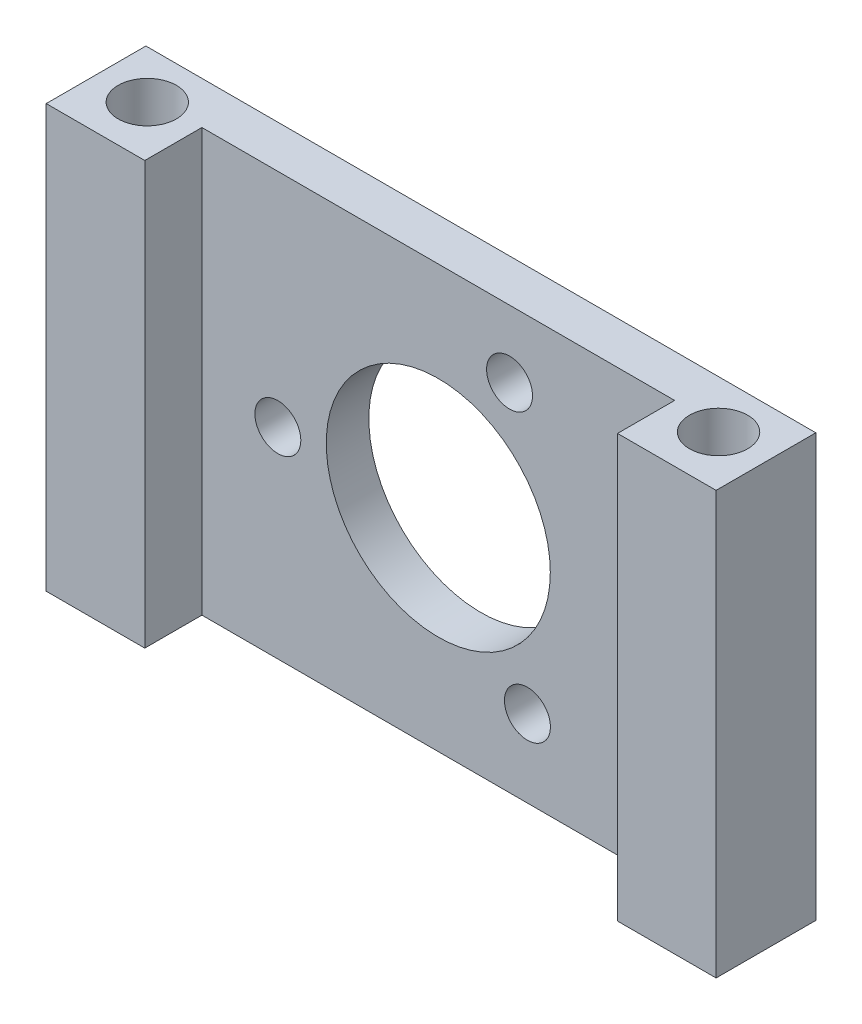
ISO-10303-21;
HEADER;
FILE_DESCRIPTION(('STEP AP214'),'2;1');
FILE_NAME('part.step','',(''),(''),'','','');
FILE_SCHEMA(('AUTOMOTIVE_DESIGN { 1 0 10303 214 1 1 1 1 }'));
ENDSEC;
DATA;
#1=APPLICATION_CONTEXT('core data for automotive mechanical design processes');
#2=APPLICATION_PROTOCOL_DEFINITION('international standard','automotive_design',2000,#1);
#3=PRODUCT_CONTEXT('',#1,'mechanical');
#4=PRODUCT('Part','Part','',(#3));
#5=PRODUCT_RELATED_PRODUCT_CATEGORY('part','',(#4));
#6=PRODUCT_DEFINITION_FORMATION('','',#4);
#7=PRODUCT_DEFINITION_CONTEXT('part definition',#1,'design');
#8=PRODUCT_DEFINITION('design','',#6,#7);
#9=PRODUCT_DEFINITION_SHAPE('','',#8);
#10=(LENGTH_UNIT() NAMED_UNIT(*) SI_UNIT(.MILLI.,.METRE.));
#11=(NAMED_UNIT(*) PLANE_ANGLE_UNIT() SI_UNIT($,.RADIAN.));
#12=(NAMED_UNIT(*) SI_UNIT($,.STERADIAN.) SOLID_ANGLE_UNIT());
#13=UNCERTAINTY_MEASURE_WITH_UNIT(LENGTH_MEASURE(1.E-05),#10,'distance_accuracy_value','');
#14=(GEOMETRIC_REPRESENTATION_CONTEXT(3) GLOBAL_UNCERTAINTY_ASSIGNED_CONTEXT((#13)) GLOBAL_UNIT_ASSIGNED_CONTEXT((#10,
#11,#12)) REPRESENTATION_CONTEXT('',''));
#15=CARTESIAN_POINT('',(0.,0.,0.));
#16=DIRECTION('',(0.,0.,1.));
#17=DIRECTION('',(1.,0.,0.));
#18=AXIS2_PLACEMENT_3D('',#15,#16,#17);
#19=CARTESIAN_POINT('',(0.,0.,8.9));
#20=DIRECTION('',(0.,0.,1.));
#21=DIRECTION('',(1.,0.,0.));
#22=AXIS2_PLACEMENT_3D('',#19,#20,#21);
#23=PLANE('',#22);
#24=DIRECTION('',(0.,-1.,0.));
#25=VECTOR('',#24,1.);
#26=CARTESIAN_POINT('',(-21.1000000000002,18.85,8.9));
#27=LINE('',#26,#25);
#28=CARTESIAN_POINT('',(-21.1000000000002,18.85,8.9));
#29=VERTEX_POINT('',#28);
#30=CARTESIAN_POINT('',(-21.1000000000002,-18.85,8.9));
#31=VERTEX_POINT('',#30);
#32=EDGE_CURVE('E117',#29,#31,#27,.T.);
#33=ORIENTED_EDGE('',*,*,#32,.F.);
#34=DIRECTION('',(-1.,0.,0.));
#35=VECTOR('',#34,1.);
#36=CARTESIAN_POINT('',(-29.9000000000002,18.85,8.9));
#37=LINE('',#36,#35);
#38=CARTESIAN_POINT('',(-29.9000000000002,18.85,8.9));
#39=VERTEX_POINT('',#38);
#40=EDGE_CURVE('E150',#29,#39,#37,.T.);
#41=ORIENTED_EDGE('',*,*,#40,.T.);
#42=DIRECTION('',(0.,-1.,0.));
#43=VECTOR('',#42,1.);
#44=CARTESIAN_POINT('',(-29.9000000000002,18.85,8.9));
#45=LINE('',#44,#43);
#46=CARTESIAN_POINT('',(-29.9000000000002,-18.85,8.9));
#47=VERTEX_POINT('',#46);
#48=EDGE_CURVE('E152',#39,#47,#45,.T.);
#49=ORIENTED_EDGE('',*,*,#48,.T.);
#50=DIRECTION('',(1.,0.,0.));
#51=VECTOR('',#50,1.);
#52=CARTESIAN_POINT('',(-29.9000000000002,-18.85,8.9));
#53=LINE('',#52,#51);
#54=EDGE_CURVE('E154',#47,#31,#53,.T.);
#55=ORIENTED_EDGE('',*,*,#54,.T.);
#56=EDGE_LOOP('',(#33,#41,#49,#55));
#57=FACE_BOUND('',#56,.T.);
#58=ADVANCED_FACE('F37',(#57),#23,.T.);
#59=CARTESIAN_POINT('',(29.8999999999998,18.85,8.9));
#60=DIRECTION('',(-1.,0.,0.));
#61=DIRECTION('',(0.,-1.,0.));
#62=AXIS2_PLACEMENT_3D('',#59,#60,#61);
#63=PLANE('',#62);
#64=DIRECTION('',(0.,1.,0.));
#65=VECTOR('',#64,1.);
#66=CARTESIAN_POINT('',(29.8999999999998,18.85,0.));
#67=LINE('',#66,#65);
#68=CARTESIAN_POINT('',(29.8999999999998,-18.85,0.));
#69=VERTEX_POINT('',#68);
#70=CARTESIAN_POINT('',(29.8999999999998,18.85,0.));
#71=VERTEX_POINT('',#70);
#72=EDGE_CURVE('E144',#69,#71,#67,.T.);
#73=ORIENTED_EDGE('',*,*,#72,.T.);
#74=DIRECTION('',(0.,0.,-1.));
#75=VECTOR('',#74,1.);
#76=CARTESIAN_POINT('',(29.8999999999998,18.85,8.9));
#77=LINE('',#76,#75);
#78=CARTESIAN_POINT('',(29.8999999999998,18.85,8.9));
#79=VERTEX_POINT('',#78);
#80=EDGE_CURVE('E11',#79,#71,#77,.T.);
#81=ORIENTED_EDGE('',*,*,#80,.F.);
#82=DIRECTION('',(0.,1.,0.));
#83=VECTOR('',#82,1.);
#84=CARTESIAN_POINT('',(29.8999999999998,18.85,8.9));
#85=LINE('',#84,#83);
#86=CARTESIAN_POINT('',(29.8999999999998,-18.85,8.9));
#87=VERTEX_POINT('',#86);
#88=EDGE_CURVE('E148',#87,#79,#85,.T.);
#89=ORIENTED_EDGE('',*,*,#88,.F.);
#90=DIRECTION('',(0.,0.,-1.));
#91=VECTOR('',#90,1.);
#92=CARTESIAN_POINT('',(29.8999999999998,-18.85,8.9));
#93=LINE('',#92,#91);
#94=EDGE_CURVE('E156',#87,#69,#93,.T.);
#95=ORIENTED_EDGE('',*,*,#94,.T.);
#96=EDGE_LOOP('',(#73,#81,#89,#95));
#97=FACE_BOUND('',#96,.T.);
#98=ADVANCED_FACE('F39',(#97),#63,.F.);
#99=CARTESIAN_POINT('',(-29.9000000000002,18.85,8.9));
#100=DIRECTION('',(0.,-1.,0.));
#101=DIRECTION('',(0.,0.,-1.));
#102=AXIS2_PLACEMENT_3D('',#99,#100,#101);
#103=PLANE('',#102);
#104=CARTESIAN_POINT('',(25.4999999999998,18.85,4.27874065550468));
#105=DIRECTION('',(0.,1.,0.));
#106=DIRECTION('',(0.,0.,1.));
#107=AXIS2_PLACEMENT_3D('',#104,#105,#106);
#108=CIRCLE('',#107,2.6);
#109=CARTESIAN_POINT('',(25.4999999999998,18.85,6.87874065550468));
#110=VERTEX_POINT('',#109);
#111=EDGE_CURVE('E212',#110,#110,#108,.T.);
#112=ORIENTED_EDGE('',*,*,#111,.F.);
#113=EDGE_LOOP('',(#112));
#114=FACE_BOUND('',#113,.T.);
#115=CARTESIAN_POINT('',(-25.4999999999998,18.85,4.27874065550468));
#116=DIRECTION('',(0.,1.,0.));
#117=DIRECTION('',(0.,0.,-1.));
#118=AXIS2_PLACEMENT_3D('',#115,#116,#117);
#119=CIRCLE('',#118,2.6);
#120=CARTESIAN_POINT('',(-25.4999999999998,18.85,1.67874065550468));
#121=VERTEX_POINT('',#120);
#122=EDGE_CURVE('E215',#121,#121,#119,.T.);
#123=ORIENTED_EDGE('',*,*,#122,.F.);
#124=EDGE_LOOP('',(#123));
#125=FACE_BOUND('',#124,.T.);
#126=ORIENTED_EDGE('',*,*,#40,.F.);
#127=DIRECTION('',(0.,0.,1.));
#128=VECTOR('',#127,1.);
#129=CARTESIAN_POINT('',(-21.1000000000002,18.85,3.8));
#130=LINE('',#129,#128);
#131=CARTESIAN_POINT('',(-21.1000000000002,18.85,3.8));
#132=VERTEX_POINT('',#131);
#133=EDGE_CURVE('E142',#132,#29,#130,.T.);
#134=ORIENTED_EDGE('',*,*,#133,.F.);
#135=DIRECTION('',(-1.,0.,0.));
#136=VECTOR('',#135,1.);
#137=CARTESIAN_POINT('',(-21.1000000000002,18.85,3.8));
#138=LINE('',#137,#136);
#139=CARTESIAN_POINT('',(21.0999999999998,18.85,3.8));
#140=VERTEX_POINT('',#139);
#141=EDGE_CURVE('E121',#140,#132,#138,.T.);
#142=ORIENTED_EDGE('',*,*,#141,.F.);
#143=DIRECTION('',(0.,0.,1.));
#144=VECTOR('',#143,1.);
#145=CARTESIAN_POINT('',(21.0999999999998,18.85,3.8));
#146=LINE('',#145,#144);
#147=CARTESIAN_POINT('',(21.0999999999998,18.85,8.9));
#148=VERTEX_POINT('',#147);
#149=EDGE_CURVE('E145',#140,#148,#146,.T.);
#150=ORIENTED_EDGE('',*,*,#149,.T.);
#151=EDGE_CURVE('E89',#79,#148,#37,.T.);
#152=ORIENTED_EDGE('',*,*,#151,.F.);
#153=ORIENTED_EDGE('',*,*,#80,.T.);
#154=DIRECTION('',(-1.,0.,0.));
#155=VECTOR('',#154,1.);
#156=CARTESIAN_POINT('',(-29.9000000000002,18.85,0.));
#157=LINE('',#156,#155);
#158=CARTESIAN_POINT('',(-29.9000000000002,18.85,0.));
#159=VERTEX_POINT('',#158);
#160=EDGE_CURVE('E159',#71,#159,#157,.T.);
#161=ORIENTED_EDGE('',*,*,#160,.T.);
#162=DIRECTION('',(0.,0.,-1.));
#163=VECTOR('',#162,1.);
#164=CARTESIAN_POINT('',(-29.9000000000002,18.85,8.9));
#165=LINE('',#164,#163);
#166=EDGE_CURVE('E45',#39,#159,#165,.T.);
#167=ORIENTED_EDGE('',*,*,#166,.F.);
#168=EDGE_LOOP('',(#126,#134,#142,#150,#152,#153,#161,#167));
#169=FACE_BOUND('',#168,.T.);
#170=ADVANCED_FACE('F182',(#114,#125,#169),#103,.F.);
#171=CARTESIAN_POINT('',(-29.9000000000002,18.85,8.9));
#172=DIRECTION('',(1.,0.,0.));
#173=DIRECTION('',(0.,1.,0.));
#174=AXIS2_PLACEMENT_3D('',#171,#172,#173);
#175=PLANE('',#174);
#176=DIRECTION('',(0.,-1.,0.));
#177=VECTOR('',#176,1.);
#178=CARTESIAN_POINT('',(-29.9000000000002,18.85,0.));
#179=LINE('',#178,#177);
#180=CARTESIAN_POINT('',(-29.9000000000002,-18.85,0.));
#181=VERTEX_POINT('',#180);
#182=EDGE_CURVE('E161',#159,#181,#179,.T.);
#183=ORIENTED_EDGE('',*,*,#182,.T.);
#184=DIRECTION('',(0.,0.,-1.));
#185=VECTOR('',#184,1.);
#186=CARTESIAN_POINT('',(-29.9000000000002,-18.85,8.9));
#187=LINE('',#186,#185);
#188=EDGE_CURVE('E165',#47,#181,#187,.T.);
#189=ORIENTED_EDGE('',*,*,#188,.F.);
#190=ORIENTED_EDGE('',*,*,#48,.F.);
#191=ORIENTED_EDGE('',*,*,#166,.T.);
#192=EDGE_LOOP('',(#183,#189,#190,#191));
#193=FACE_BOUND('',#192,.T.);
#194=ADVANCED_FACE('F171',(#193),#175,.F.);
#195=CARTESIAN_POINT('',(-29.9000000000002,-18.85,8.9));
#196=DIRECTION('',(0.,1.,0.));
#197=DIRECTION('',(0.,0.,1.));
#198=AXIS2_PLACEMENT_3D('',#195,#196,#197);
#199=PLANE('',#198);
#200=CARTESIAN_POINT('',(25.4999999999998,-18.85,4.27874065550468));
#201=DIRECTION('',(0.,1.,0.));
#202=DIRECTION('',(0.,0.,1.));
#203=AXIS2_PLACEMENT_3D('',#200,#201,#202);
#204=CIRCLE('',#203,2.6);
#205=CARTESIAN_POINT('',(25.4999999999998,-18.85,6.87874065550468));
#206=VERTEX_POINT('',#205);
#207=EDGE_CURVE('E140',#206,#206,#204,.T.);
#208=ORIENTED_EDGE('',*,*,#207,.T.);
#209=EDGE_LOOP('',(#208));
#210=FACE_BOUND('',#209,.T.);
#211=CARTESIAN_POINT('',(-25.4999999999998,-18.85,4.27874065550468));
#212=DIRECTION('',(0.,1.,0.));
#213=DIRECTION('',(0.,0.,-1.));
#214=AXIS2_PLACEMENT_3D('',#211,#212,#213);
#215=CIRCLE('',#214,2.6);
#216=CARTESIAN_POINT('',(-25.4999999999998,-18.85,1.67874065550468));
#217=VERTEX_POINT('',#216);
#218=EDGE_CURVE('E217',#217,#217,#215,.T.);
#219=ORIENTED_EDGE('',*,*,#218,.T.);
#220=EDGE_LOOP('',(#219));
#221=FACE_BOUND('',#220,.T.);
#222=DIRECTION('',(1.,0.,0.));
#223=VECTOR('',#222,1.);
#224=CARTESIAN_POINT('',(-21.1000000000002,-18.85,3.8));
#225=LINE('',#224,#223);
#226=CARTESIAN_POINT('',(-21.1000000000002,-18.85,3.8));
#227=VERTEX_POINT('',#226);
#228=CARTESIAN_POINT('',(21.0999999999998,-18.85,3.8));
#229=VERTEX_POINT('',#228);
#230=EDGE_CURVE('E127',#227,#229,#225,.T.);
#231=ORIENTED_EDGE('',*,*,#230,.F.);
#232=DIRECTION('',(0.,0.,1.));
#233=VECTOR('',#232,1.);
#234=CARTESIAN_POINT('',(-21.1000000000002,-18.85,3.8));
#235=LINE('',#234,#233);
#236=EDGE_CURVE('E111',#227,#31,#235,.T.);
#237=ORIENTED_EDGE('',*,*,#236,.T.);
#238=ORIENTED_EDGE('',*,*,#54,.F.);
#239=ORIENTED_EDGE('',*,*,#188,.T.);
#240=DIRECTION('',(1.,0.,0.));
#241=VECTOR('',#240,1.);
#242=CARTESIAN_POINT('',(-29.9000000000002,-18.85,0.));
#243=LINE('',#242,#241);
#244=EDGE_CURVE('E82',#181,#69,#243,.T.);
#245=ORIENTED_EDGE('',*,*,#244,.T.);
#246=ORIENTED_EDGE('',*,*,#94,.F.);
#247=CARTESIAN_POINT('',(21.0999999999998,-18.85,8.9));
#248=VERTEX_POINT('',#247);
#249=EDGE_CURVE('E60',#248,#87,#53,.T.);
#250=ORIENTED_EDGE('',*,*,#249,.F.);
#251=DIRECTION('',(0.,0.,1.));
#252=VECTOR('',#251,1.);
#253=CARTESIAN_POINT('',(21.0999999999998,-18.85,3.8));
#254=LINE('',#253,#252);
#255=EDGE_CURVE('E52',#229,#248,#254,.T.);
#256=ORIENTED_EDGE('',*,*,#255,.F.);
#257=EDGE_LOOP('',(#231,#237,#238,#239,#245,#246,#250,#256));
#258=FACE_BOUND('',#257,.T.);
#259=ADVANCED_FACE('F132',(#210,#221,#258),#199,.F.);
#260=DIRECTION('',(0.,1.,0.));
#261=VECTOR('',#260,1.);
#262=CARTESIAN_POINT('',(21.0999999999998,18.85,8.9));
#263=LINE('',#262,#261);
#264=EDGE_CURVE('E130',#248,#148,#263,.T.);
#265=ORIENTED_EDGE('',*,*,#264,.F.);
#266=ORIENTED_EDGE('',*,*,#249,.T.);
#267=ORIENTED_EDGE('',*,*,#88,.T.);
#268=ORIENTED_EDGE('',*,*,#151,.T.);
#269=EDGE_LOOP('',(#265,#266,#267,#268));
#270=FACE_BOUND('',#269,.T.);
#271=ADVANCED_FACE('F180',(#270),#23,.T.);
#272=CARTESIAN_POINT('',(0.,0.,0.));
#273=DIRECTION('',(0.,0.,1.));
#274=DIRECTION('',(1.,0.,0.));
#275=AXIS2_PLACEMENT_3D('',#272,#273,#274);
#276=PLANE('',#275);
#277=CARTESIAN_POINT('',(6.36266546350954,12.8623088207158,0.));
#278=DIRECTION('',(0.,0.,1.));
#279=DIRECTION('',(1.,0.,0.));
#280=AXIS2_PLACEMENT_3D('',#277,#278,#279);
#281=CIRCLE('',#280,2.05);
#282=CARTESIAN_POINT('',(8.41266546350954,12.8623088207158,0.));
#283=VERTEX_POINT('',#282);
#284=EDGE_CURVE('E230',#283,#283,#281,.T.);
#285=ORIENTED_EDGE('',*,*,#284,.T.);
#286=EDGE_LOOP('',(#285));
#287=FACE_BOUND('',#286,.T.);
#288=CARTESIAN_POINT('',(-14.3204189218157,-0.920924483176149,0.));
#289=DIRECTION('',(0.,0.,1.));
#290=DIRECTION('',(1.,0.,0.));
#291=AXIS2_PLACEMENT_3D('',#288,#289,#290);
#292=CIRCLE('',#291,2.05);
#293=CARTESIAN_POINT('',(-12.2704189218157,-0.920924483176149,0.));
#294=VERTEX_POINT('',#293);
#295=EDGE_CURVE('E236',#294,#294,#292,.T.);
#296=ORIENTED_EDGE('',*,*,#295,.T.);
#297=EDGE_LOOP('',(#296));
#298=FACE_BOUND('',#297,.T.);
#299=CARTESIAN_POINT('',(7.95775345830505,-11.9413843375391,0.));
#300=DIRECTION('',(0.,0.,1.));
#301=DIRECTION('',(1.,0.,0.));
#302=AXIS2_PLACEMENT_3D('',#299,#300,#301);
#303=CIRCLE('',#302,2.05);
#304=CARTESIAN_POINT('',(10.0077534583051,-11.9413843375391,0.));
#305=VERTEX_POINT('',#304);
#306=EDGE_CURVE('E242',#305,#305,#303,.T.);
#307=ORIENTED_EDGE('',*,*,#306,.T.);
#308=EDGE_LOOP('',(#307));
#309=FACE_BOUND('',#308,.T.);
#310=CARTESIAN_POINT('',(0.,0.,0.));
#311=DIRECTION('',(0.,0.,1.));
#312=DIRECTION('',(1.,0.,0.));
#313=AXIS2_PLACEMENT_3D('',#310,#311,#312);
#314=CIRCLE('',#313,10.);
#315=CARTESIAN_POINT('',(10.,0.,0.));
#316=VERTEX_POINT('',#315);
#317=EDGE_CURVE('E221',#316,#316,#314,.T.);
#318=ORIENTED_EDGE('',*,*,#317,.T.);
#319=EDGE_LOOP('',(#318));
#320=FACE_BOUND('',#319,.T.);
#321=ORIENTED_EDGE('',*,*,#72,.F.);
#322=ORIENTED_EDGE('',*,*,#244,.F.);
#323=ORIENTED_EDGE('',*,*,#182,.F.);
#324=ORIENTED_EDGE('',*,*,#160,.F.);
#325=EDGE_LOOP('',(#321,#322,#323,#324));
#326=FACE_BOUND('',#325,.T.);
#327=ADVANCED_FACE('F176',(#287,#298,#309,#320,#326),#276,.F.);
#328=CARTESIAN_POINT('',(-21.1000000000002,18.85,3.8));
#329=DIRECTION('',(-1.,0.,0.));
#330=DIRECTION('',(0.,-1.,0.));
#331=AXIS2_PLACEMENT_3D('',#328,#329,#330);
#332=PLANE('',#331);
#333=ORIENTED_EDGE('',*,*,#32,.T.);
#334=ORIENTED_EDGE('',*,*,#236,.F.);
#335=DIRECTION('',(0.,-1.,0.));
#336=VECTOR('',#335,1.);
#337=CARTESIAN_POINT('',(-21.1000000000002,18.85,3.8));
#338=LINE('',#337,#336);
#339=EDGE_CURVE('E114',#132,#227,#338,.T.);
#340=ORIENTED_EDGE('',*,*,#339,.F.);
#341=ORIENTED_EDGE('',*,*,#133,.T.);
#342=EDGE_LOOP('',(#333,#334,#340,#341));
#343=FACE_BOUND('',#342,.T.);
#344=ADVANCED_FACE('F113',(#343),#332,.F.);
#345=CARTESIAN_POINT('',(21.0999999999998,18.85,3.8));
#346=DIRECTION('',(1.,0.,0.));
#347=DIRECTION('',(0.,1.,0.));
#348=AXIS2_PLACEMENT_3D('',#345,#346,#347);
#349=PLANE('',#348);
#350=ORIENTED_EDGE('',*,*,#264,.T.);
#351=ORIENTED_EDGE('',*,*,#149,.F.);
#352=DIRECTION('',(0.,1.,0.));
#353=VECTOR('',#352,1.);
#354=CARTESIAN_POINT('',(21.0999999999998,18.85,3.8));
#355=LINE('',#354,#353);
#356=EDGE_CURVE('E133',#229,#140,#355,.T.);
#357=ORIENTED_EDGE('',*,*,#356,.F.);
#358=ORIENTED_EDGE('',*,*,#255,.T.);
#359=EDGE_LOOP('',(#350,#351,#357,#358));
#360=FACE_BOUND('',#359,.T.);
#361=ADVANCED_FACE('F181',(#360),#349,.F.);
#362=CARTESIAN_POINT('',(0.,0.,3.8));
#363=DIRECTION('',(0.,0.,1.));
#364=DIRECTION('',(1.,0.,0.));
#365=AXIS2_PLACEMENT_3D('',#362,#363,#364);
#366=PLANE('',#365);
#367=CARTESIAN_POINT('',(6.36266546350954,12.8623088207158,3.8));
#368=DIRECTION('',(0.,0.,1.));
#369=DIRECTION('',(1.,0.,0.));
#370=AXIS2_PLACEMENT_3D('',#367,#368,#369);
#371=CIRCLE('',#370,2.05);
#372=CARTESIAN_POINT('',(8.41266546350954,12.8623088207158,3.8));
#373=VERTEX_POINT('',#372);
#374=EDGE_CURVE('E233',#373,#373,#371,.T.);
#375=ORIENTED_EDGE('',*,*,#374,.F.);
#376=EDGE_LOOP('',(#375));
#377=FACE_BOUND('',#376,.T.);
#378=CARTESIAN_POINT('',(-14.3204189218157,-0.920924483176149,3.8));
#379=DIRECTION('',(0.,0.,1.));
#380=DIRECTION('',(1.,0.,0.));
#381=AXIS2_PLACEMENT_3D('',#378,#379,#380);
#382=CIRCLE('',#381,2.05);
#383=CARTESIAN_POINT('',(-12.2704189218157,-0.920924483176149,3.8));
#384=VERTEX_POINT('',#383);
#385=EDGE_CURVE('E239',#384,#384,#382,.T.);
#386=ORIENTED_EDGE('',*,*,#385,.F.);
#387=EDGE_LOOP('',(#386));
#388=FACE_BOUND('',#387,.T.);
#389=CARTESIAN_POINT('',(7.95775345830505,-11.9413843375391,3.8));
#390=DIRECTION('',(0.,0.,1.));
#391=DIRECTION('',(1.,0.,0.));
#392=AXIS2_PLACEMENT_3D('',#389,#390,#391);
#393=CIRCLE('',#392,2.05);
#394=CARTESIAN_POINT('',(10.0077534583051,-11.9413843375391,3.8));
#395=VERTEX_POINT('',#394);
#396=EDGE_CURVE('E227',#395,#395,#393,.T.);
#397=ORIENTED_EDGE('',*,*,#396,.F.);
#398=EDGE_LOOP('',(#397));
#399=FACE_BOUND('',#398,.T.);
#400=CARTESIAN_POINT('',(0.,0.,3.8));
#401=DIRECTION('',(0.,0.,1.));
#402=DIRECTION('',(1.,0.,0.));
#403=AXIS2_PLACEMENT_3D('',#400,#401,#402);
#404=CIRCLE('',#403,10.);
#405=CARTESIAN_POINT('',(10.,0.,3.8));
#406=VERTEX_POINT('',#405);
#407=EDGE_CURVE('E224',#406,#406,#404,.T.);
#408=ORIENTED_EDGE('',*,*,#407,.F.);
#409=EDGE_LOOP('',(#408));
#410=FACE_BOUND('',#409,.T.);
#411=ORIENTED_EDGE('',*,*,#339,.T.);
#412=ORIENTED_EDGE('',*,*,#230,.T.);
#413=ORIENTED_EDGE('',*,*,#356,.T.);
#414=ORIENTED_EDGE('',*,*,#141,.T.);
#415=EDGE_LOOP('',(#411,#412,#413,#414));
#416=FACE_BOUND('',#415,.T.);
#417=ADVANCED_FACE('F125',(#377,#388,#399,#410,#416),#366,.T.);
#418=CARTESIAN_POINT('',(-25.4999999999998,-18.85,4.27874065550468));
#419=DIRECTION('',(0.,1.,0.));
#420=DIRECTION('',(0.,0.,1.));
#421=AXIS2_PLACEMENT_3D('',#418,#419,#420);
#422=CYLINDRICAL_SURFACE('',#421,2.6);
#423=ORIENTED_EDGE('',*,*,#218,.F.);
#424=EDGE_LOOP('',(#423));
#425=FACE_BOUND('',#424,.T.);
#426=ORIENTED_EDGE('',*,*,#122,.T.);
#427=EDGE_LOOP('',(#426));
#428=FACE_BOUND('',#427,.T.);
#429=ADVANCED_FACE('F252',(#425,#428),#422,.F.);
#430=CARTESIAN_POINT('',(25.4999999999998,-18.85,4.27874065550468));
#431=DIRECTION('',(0.,1.,0.));
#432=DIRECTION('',(0.,0.,1.));
#433=AXIS2_PLACEMENT_3D('',#430,#431,#432);
#434=CYLINDRICAL_SURFACE('',#433,2.6);
#435=ORIENTED_EDGE('',*,*,#207,.F.);
#436=EDGE_LOOP('',(#435));
#437=FACE_BOUND('',#436,.T.);
#438=ORIENTED_EDGE('',*,*,#111,.T.);
#439=EDGE_LOOP('',(#438));
#440=FACE_BOUND('',#439,.T.);
#441=ADVANCED_FACE('F259',(#437,#440),#434,.F.);
#442=CARTESIAN_POINT('',(0.,0.,0.));
#443=DIRECTION('',(0.,0.,1.));
#444=DIRECTION('',(1.,0.,0.));
#445=AXIS2_PLACEMENT_3D('',#442,#443,#444);
#446=CYLINDRICAL_SURFACE('',#445,10.);
#447=ORIENTED_EDGE('',*,*,#317,.F.);
#448=EDGE_LOOP('',(#447));
#449=FACE_BOUND('',#448,.T.);
#450=ORIENTED_EDGE('',*,*,#407,.T.);
#451=EDGE_LOOP('',(#450));
#452=FACE_BOUND('',#451,.T.);
#453=ADVANCED_FACE('F257',(#449,#452),#446,.F.);
#454=CARTESIAN_POINT('',(7.95775345830505,-11.9413843375391,0.));
#455=DIRECTION('',(0.,0.,1.));
#456=DIRECTION('',(1.,0.,0.));
#457=AXIS2_PLACEMENT_3D('',#454,#455,#456);
#458=CYLINDRICAL_SURFACE('',#457,2.05);
#459=ORIENTED_EDGE('',*,*,#306,.F.);
#460=EDGE_LOOP('',(#459));
#461=FACE_BOUND('',#460,.T.);
#462=ORIENTED_EDGE('',*,*,#396,.T.);
#463=EDGE_LOOP('',(#462));
#464=FACE_BOUND('',#463,.T.);
#465=ADVANCED_FACE('F248',(#461,#464),#458,.F.);
#466=CARTESIAN_POINT('',(-14.3204189218157,-0.920924483176149,0.));
#467=DIRECTION('',(0.,0.,1.));
#468=DIRECTION('',(1.,0.,0.));
#469=AXIS2_PLACEMENT_3D('',#466,#467,#468);
#470=CYLINDRICAL_SURFACE('',#469,2.05);
#471=ORIENTED_EDGE('',*,*,#295,.F.);
#472=EDGE_LOOP('',(#471));
#473=FACE_BOUND('',#472,.T.);
#474=ORIENTED_EDGE('',*,*,#385,.T.);
#475=EDGE_LOOP('',(#474));
#476=FACE_BOUND('',#475,.T.);
#477=ADVANCED_FACE('F266',(#473,#476),#470,.F.);
#478=CARTESIAN_POINT('',(6.36266546350954,12.8623088207158,0.));
#479=DIRECTION('',(0.,0.,1.));
#480=DIRECTION('',(1.,0.,0.));
#481=AXIS2_PLACEMENT_3D('',#478,#479,#480);
#482=CYLINDRICAL_SURFACE('',#481,2.05);
#483=ORIENTED_EDGE('',*,*,#284,.F.);
#484=EDGE_LOOP('',(#483));
#485=FACE_BOUND('',#484,.T.);
#486=ORIENTED_EDGE('',*,*,#374,.T.);
#487=EDGE_LOOP('',(#486));
#488=FACE_BOUND('',#487,.T.);
#489=ADVANCED_FACE('F273',(#485,#488),#482,.F.);
#490=CLOSED_SHELL('',(#58,#98,#170,#194,#259,#271,#327,#344,#361,#417,#429,#441,#453,#465,#477,#489));
#491=MANIFOLD_SOLID_BREP('B2',#490);
#492=ADVANCED_BREP_SHAPE_REPRESENTATION('',(#18,#491),#14);
#493=SHAPE_DEFINITION_REPRESENTATION(#9,#492);
ENDSEC;
END-ISO-10303-21;
